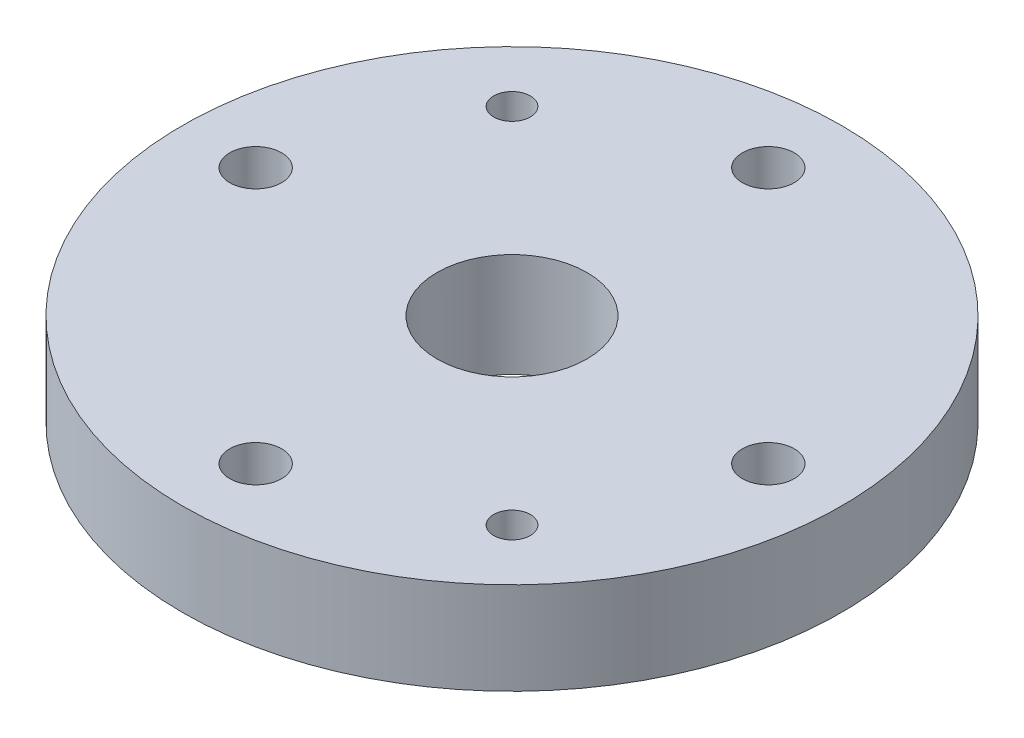
ISO-10303-21;
HEADER;
FILE_DESCRIPTION(('STEP AP214'),'2;1');
FILE_NAME('part.step','',(''),(''),'','','');
FILE_SCHEMA(('AUTOMOTIVE_DESIGN { 1 0 10303 214 1 1 1 1 }'));
ENDSEC;
DATA;
#1=APPLICATION_CONTEXT('core data for automotive mechanical design processes');
#2=APPLICATION_PROTOCOL_DEFINITION('international standard','automotive_design',2000,#1);
#3=PRODUCT_CONTEXT('',#1,'mechanical');
#4=PRODUCT('Part','Part','',(#3));
#5=PRODUCT_RELATED_PRODUCT_CATEGORY('part','',(#4));
#6=PRODUCT_DEFINITION_FORMATION('','',#4);
#7=PRODUCT_DEFINITION_CONTEXT('part definition',#1,'design');
#8=PRODUCT_DEFINITION('design','',#6,#7);
#9=PRODUCT_DEFINITION_SHAPE('','',#8);
#10=(LENGTH_UNIT() NAMED_UNIT(*) SI_UNIT(.MILLI.,.METRE.));
#11=(NAMED_UNIT(*) PLANE_ANGLE_UNIT() SI_UNIT($,.RADIAN.));
#12=(NAMED_UNIT(*) SI_UNIT($,.STERADIAN.) SOLID_ANGLE_UNIT());
#13=UNCERTAINTY_MEASURE_WITH_UNIT(LENGTH_MEASURE(1.E-05),#10,'distance_accuracy_value','');
#14=(GEOMETRIC_REPRESENTATION_CONTEXT(3) GLOBAL_UNCERTAINTY_ASSIGNED_CONTEXT((#13)) GLOBAL_UNIT_ASSIGNED_CONTEXT((#10,
#11,#12)) REPRESENTATION_CONTEXT('',''));
#15=CARTESIAN_POINT('',(0.,0.,0.));
#16=DIRECTION('',(0.,0.,1.));
#17=DIRECTION('',(1.,0.,0.));
#18=AXIS2_PLACEMENT_3D('',#15,#16,#17);
#19=CARTESIAN_POINT('',(0.,-2.,0.));
#20=DIRECTION('',(0.,-1.,0.));
#21=DIRECTION('',(0.,0.,-1.));
#22=AXIS2_PLACEMENT_3D('',#19,#20,#21);
#23=PLANE('',#22);
#24=CARTESIAN_POINT('',(-31.4308964237421,-2.,-31.430896423742));
#25=DIRECTION('',(0.,-1.,0.));
#26=DIRECTION('',(0.,0.,-1.));
#27=AXIS2_PLACEMENT_3D('',#24,#25,#26);
#28=CIRCLE('',#27,3.175);
#29=CARTESIAN_POINT('',(-31.4308964237421,-2.,-34.605896423742));
#30=VERTEX_POINT('',#29);
#31=EDGE_CURVE('E91',#30,#30,#28,.T.);
#32=ORIENTED_EDGE('',*,*,#31,.F.);
#33=EDGE_LOOP('',(#32));
#34=FACE_BOUND('',#33,.T.);
#35=CARTESIAN_POINT('',(31.4308964237421,-2.,31.430896423742));
#36=DIRECTION('',(0.,-1.,0.));
#37=DIRECTION('',(0.,0.,-1.));
#38=AXIS2_PLACEMENT_3D('',#35,#36,#37);
#39=CIRCLE('',#38,3.175);
#40=CARTESIAN_POINT('',(31.4308964237421,-2.,28.255896423742));
#41=VERTEX_POINT('',#40);
#42=EDGE_CURVE('E85',#41,#41,#39,.T.);
#43=ORIENTED_EDGE('',*,*,#42,.F.);
#44=EDGE_LOOP('',(#43));
#45=FACE_BOUND('',#44,.T.);
#46=CARTESIAN_POINT('',(0.,-2.,44.45));
#47=DIRECTION('',(0.,-1.,0.));
#48=DIRECTION('',(0.,0.,-1.));
#49=AXIS2_PLACEMENT_3D('',#46,#47,#48);
#50=CIRCLE('',#49,4.5);
#51=CARTESIAN_POINT('',(0.,-2.,39.95));
#52=VERTEX_POINT('',#51);
#53=EDGE_CURVE('E79',#52,#52,#50,.T.);
#54=ORIENTED_EDGE('',*,*,#53,.F.);
#55=EDGE_LOOP('',(#54));
#56=FACE_BOUND('',#55,.T.);
#57=CARTESIAN_POINT('',(-44.45,-2.,0.));
#58=DIRECTION('',(0.,-1.,0.));
#59=DIRECTION('',(0.,0.,-1.));
#60=AXIS2_PLACEMENT_3D('',#57,#58,#59);
#61=CIRCLE('',#60,4.5);
#62=CARTESIAN_POINT('',(-44.45,-2.,-4.5));
#63=VERTEX_POINT('',#62);
#64=EDGE_CURVE('E73',#63,#63,#61,.T.);
#65=ORIENTED_EDGE('',*,*,#64,.F.);
#66=EDGE_LOOP('',(#65));
#67=FACE_BOUND('',#66,.T.);
#68=CARTESIAN_POINT('',(0.,-2.,-44.45));
#69=DIRECTION('',(0.,-1.,0.));
#70=DIRECTION('',(0.,0.,-1.));
#71=AXIS2_PLACEMENT_3D('',#68,#69,#70);
#72=CIRCLE('',#71,4.5);
#73=CARTESIAN_POINT('',(0.,-2.,-48.95));
#74=VERTEX_POINT('',#73);
#75=EDGE_CURVE('E67',#74,#74,#72,.T.);
#76=ORIENTED_EDGE('',*,*,#75,.F.);
#77=EDGE_LOOP('',(#76));
#78=FACE_BOUND('',#77,.T.);
#79=CARTESIAN_POINT('',(44.45,-2.,0.));
#80=DIRECTION('',(0.,-1.,0.));
#81=DIRECTION('',(0.,0.,-1.));
#82=AXIS2_PLACEMENT_3D('',#79,#80,#81);
#83=CIRCLE('',#82,4.5);
#84=CARTESIAN_POINT('',(44.45,-2.,-4.5));
#85=VERTEX_POINT('',#84);
#86=EDGE_CURVE('E61',#85,#85,#83,.T.);
#87=ORIENTED_EDGE('',*,*,#86,.F.);
#88=EDGE_LOOP('',(#87));
#89=FACE_BOUND('',#88,.T.);
#90=CARTESIAN_POINT('',(0.,-2.,0.));
#91=DIRECTION('',(0.,-1.,0.));
#92=DIRECTION('',(0.,0.,-1.));
#93=AXIS2_PLACEMENT_3D('',#90,#91,#92);
#94=CIRCLE('',#93,57.15);
#95=CARTESIAN_POINT('',(0.,-2.,-57.15));
#96=VERTEX_POINT('',#95);
#97=EDGE_CURVE('E10',#96,#96,#94,.T.);
#98=ORIENTED_EDGE('',*,*,#97,.T.);
#99=EDGE_LOOP('',(#98));
#100=FACE_BOUND('',#99,.T.);
#101=CARTESIAN_POINT('',(0.,-2.,0.));
#102=DIRECTION('',(0.,-1.,0.));
#103=DIRECTION('',(0.,0.,-1.));
#104=AXIS2_PLACEMENT_3D('',#101,#102,#103);
#105=CIRCLE('',#104,15.);
#106=CARTESIAN_POINT('',(0.,-2.,-15.));
#107=VERTEX_POINT('',#106);
#108=EDGE_CURVE('E46',#107,#107,#105,.T.);
#109=ORIENTED_EDGE('',*,*,#108,.F.);
#110=EDGE_LOOP('',(#109));
#111=FACE_BOUND('',#110,.T.);
#112=ADVANCED_FACE('F35',(#34,#45,#56,#67,#78,#89,#100,#111),#23,.T.);
#113=CARTESIAN_POINT('',(0.,169.644610179245,0.));
#114=DIRECTION('',(0.,-1.,0.));
#115=DIRECTION('',(0.,0.,-1.));
#116=AXIS2_PLACEMENT_3D('',#113,#114,#115);
#117=CYLINDRICAL_SURFACE('',#116,57.15);
#118=ORIENTED_EDGE('',*,*,#97,.F.);
#119=EDGE_LOOP('',(#118));
#120=FACE_BOUND('',#119,.T.);
#121=CARTESIAN_POINT('',(0.,14.,0.));
#122=DIRECTION('',(0.,1.,0.));
#123=DIRECTION('',(0.,0.,1.));
#124=AXIS2_PLACEMENT_3D('',#121,#122,#123);
#125=CIRCLE('',#124,57.15);
#126=CARTESIAN_POINT('',(0.,14.,57.15));
#127=VERTEX_POINT('',#126);
#128=EDGE_CURVE('E55',#127,#127,#125,.T.);
#129=ORIENTED_EDGE('',*,*,#128,.F.);
#130=EDGE_LOOP('',(#129));
#131=FACE_BOUND('',#130,.T.);
#132=ADVANCED_FACE('F37',(#120,#131),#117,.T.);
#133=CARTESIAN_POINT('',(0.,44.7695526217005,0.));
#134=DIRECTION('',(0.,-1.,0.));
#135=DIRECTION('',(0.,0.,-1.));
#136=AXIS2_PLACEMENT_3D('',#133,#134,#135);
#137=CYLINDRICAL_SURFACE('',#136,13.);
#138=CARTESIAN_POINT('',(0.,-4.,0.));
#139=DIRECTION('',(0.,-1.,0.));
#140=DIRECTION('',(0.,0.,-1.));
#141=AXIS2_PLACEMENT_3D('',#138,#139,#140);
#142=CIRCLE('',#141,13.);
#143=CARTESIAN_POINT('',(0.,-4.,-13.));
#144=VERTEX_POINT('',#143);
#145=EDGE_CURVE('E51',#144,#144,#142,.T.);
#146=ORIENTED_EDGE('',*,*,#145,.T.);
#147=EDGE_LOOP('',(#146));
#148=FACE_BOUND('',#147,.T.);
#149=CARTESIAN_POINT('',(0.,14.,0.));
#150=DIRECTION('',(0.,1.,0.));
#151=DIRECTION('',(0.,0.,1.));
#152=AXIS2_PLACEMENT_3D('',#149,#150,#151);
#153=CIRCLE('',#152,13.);
#154=CARTESIAN_POINT('',(0.,14.,13.));
#155=VERTEX_POINT('',#154);
#156=EDGE_CURVE('E58',#155,#155,#153,.T.);
#157=ORIENTED_EDGE('',*,*,#156,.T.);
#158=EDGE_LOOP('',(#157));
#159=FACE_BOUND('',#158,.T.);
#160=ADVANCED_FACE('F120',(#148,#159),#137,.F.);
#161=CARTESIAN_POINT('',(0.,-4.,0.));
#162=DIRECTION('',(0.,-1.,0.));
#163=DIRECTION('',(0.,0.,-1.));
#164=AXIS2_PLACEMENT_3D('',#161,#162,#163);
#165=PLANE('',#164);
#166=CARTESIAN_POINT('',(0.,-4.,0.));
#167=DIRECTION('',(0.,-1.,0.));
#168=DIRECTION('',(0.,0.,-1.));
#169=AXIS2_PLACEMENT_3D('',#166,#167,#168);
#170=CIRCLE('',#169,15.);
#171=CARTESIAN_POINT('',(0.,-4.,-15.));
#172=VERTEX_POINT('',#171);
#173=EDGE_CURVE('E42',#172,#172,#170,.T.);
#174=ORIENTED_EDGE('',*,*,#173,.T.);
#175=EDGE_LOOP('',(#174));
#176=FACE_BOUND('',#175,.T.);
#177=ORIENTED_EDGE('',*,*,#145,.F.);
#178=EDGE_LOOP('',(#177));
#179=FACE_BOUND('',#178,.T.);
#180=ADVANCED_FACE('F122',(#176,#179),#165,.T.);
#181=CARTESIAN_POINT('',(0.,-4.,0.));
#182=DIRECTION('',(0.,1.,0.));
#183=DIRECTION('',(0.,0.,1.));
#184=AXIS2_PLACEMENT_3D('',#181,#182,#183);
#185=CYLINDRICAL_SURFACE('',#184,15.);
#186=ORIENTED_EDGE('',*,*,#173,.F.);
#187=EDGE_LOOP('',(#186));
#188=FACE_BOUND('',#187,.T.);
#189=ORIENTED_EDGE('',*,*,#108,.T.);
#190=EDGE_LOOP('',(#189));
#191=FACE_BOUND('',#190,.T.);
#192=ADVANCED_FACE('F104',(#188,#191),#185,.T.);
#193=CARTESIAN_POINT('',(0.,14.,0.));
#194=DIRECTION('',(0.,1.,0.));
#195=DIRECTION('',(0.,0.,1.));
#196=AXIS2_PLACEMENT_3D('',#193,#194,#195);
#197=PLANE('',#196);
#198=CARTESIAN_POINT('',(-31.4308964237421,14.,-31.430896423742));
#199=DIRECTION('',(0.,1.,0.));
#200=DIRECTION('',(0.,0.,1.));
#201=AXIS2_PLACEMENT_3D('',#198,#199,#200);
#202=CIRCLE('',#201,3.175);
#203=CARTESIAN_POINT('',(-31.4308964237421,14.,-28.255896423742));
#204=VERTEX_POINT('',#203);
#205=EDGE_CURVE('E94',#204,#204,#202,.T.);
#206=ORIENTED_EDGE('',*,*,#205,.F.);
#207=EDGE_LOOP('',(#206));
#208=FACE_BOUND('',#207,.T.);
#209=CARTESIAN_POINT('',(31.4308964237421,14.,31.430896423742));
#210=DIRECTION('',(0.,1.,0.));
#211=DIRECTION('',(0.,0.,1.));
#212=AXIS2_PLACEMENT_3D('',#209,#210,#211);
#213=CIRCLE('',#212,3.175);
#214=CARTESIAN_POINT('',(31.4308964237421,14.,34.605896423742));
#215=VERTEX_POINT('',#214);
#216=EDGE_CURVE('E88',#215,#215,#213,.T.);
#217=ORIENTED_EDGE('',*,*,#216,.F.);
#218=EDGE_LOOP('',(#217));
#219=FACE_BOUND('',#218,.T.);
#220=CARTESIAN_POINT('',(0.,14.,44.45));
#221=DIRECTION('',(0.,1.,0.));
#222=DIRECTION('',(0.,0.,1.));
#223=AXIS2_PLACEMENT_3D('',#220,#221,#222);
#224=CIRCLE('',#223,4.5);
#225=CARTESIAN_POINT('',(0.,14.,48.95));
#226=VERTEX_POINT('',#225);
#227=EDGE_CURVE('E82',#226,#226,#224,.T.);
#228=ORIENTED_EDGE('',*,*,#227,.F.);
#229=EDGE_LOOP('',(#228));
#230=FACE_BOUND('',#229,.T.);
#231=CARTESIAN_POINT('',(-44.45,14.,0.));
#232=DIRECTION('',(0.,1.,0.));
#233=DIRECTION('',(0.,0.,1.));
#234=AXIS2_PLACEMENT_3D('',#231,#232,#233);
#235=CIRCLE('',#234,4.5);
#236=CARTESIAN_POINT('',(-44.45,14.,4.5));
#237=VERTEX_POINT('',#236);
#238=EDGE_CURVE('E76',#237,#237,#235,.T.);
#239=ORIENTED_EDGE('',*,*,#238,.F.);
#240=EDGE_LOOP('',(#239));
#241=FACE_BOUND('',#240,.T.);
#242=CARTESIAN_POINT('',(0.,14.,-44.45));
#243=DIRECTION('',(0.,1.,0.));
#244=DIRECTION('',(0.,0.,1.));
#245=AXIS2_PLACEMENT_3D('',#242,#243,#244);
#246=CIRCLE('',#245,4.5);
#247=CARTESIAN_POINT('',(0.,14.,-39.95));
#248=VERTEX_POINT('',#247);
#249=EDGE_CURVE('E70',#248,#248,#246,.T.);
#250=ORIENTED_EDGE('',*,*,#249,.F.);
#251=EDGE_LOOP('',(#250));
#252=FACE_BOUND('',#251,.T.);
#253=CARTESIAN_POINT('',(44.45,14.,0.));
#254=DIRECTION('',(0.,1.,0.));
#255=DIRECTION('',(0.,0.,1.));
#256=AXIS2_PLACEMENT_3D('',#253,#254,#255);
#257=CIRCLE('',#256,4.5);
#258=CARTESIAN_POINT('',(44.45,14.,4.5));
#259=VERTEX_POINT('',#258);
#260=EDGE_CURVE('E64',#259,#259,#257,.T.);
#261=ORIENTED_EDGE('',*,*,#260,.F.);
#262=EDGE_LOOP('',(#261));
#263=FACE_BOUND('',#262,.T.);
#264=ORIENTED_EDGE('',*,*,#128,.T.);
#265=EDGE_LOOP('',(#264));
#266=FACE_BOUND('',#265,.T.);
#267=ORIENTED_EDGE('',*,*,#156,.F.);
#268=EDGE_LOOP('',(#267));
#269=FACE_BOUND('',#268,.T.);
#270=ADVANCED_FACE('F100',(#208,#219,#230,#241,#252,#263,#266,#269),#197,.T.);
#271=CARTESIAN_POINT('',(44.45,14.,0.));
#272=DIRECTION('',(0.,1.,0.));
#273=DIRECTION('',(0.,0.,1.));
#274=AXIS2_PLACEMENT_3D('',#271,#272,#273);
#275=CYLINDRICAL_SURFACE('',#274,4.5);
#276=ORIENTED_EDGE('',*,*,#86,.T.);
#277=EDGE_LOOP('',(#276));
#278=FACE_BOUND('',#277,.T.);
#279=ORIENTED_EDGE('',*,*,#260,.T.);
#280=EDGE_LOOP('',(#279));
#281=FACE_BOUND('',#280,.T.);
#282=ADVANCED_FACE('F103',(#278,#281),#275,.F.);
#283=CARTESIAN_POINT('',(0.,14.,-44.45));
#284=DIRECTION('',(0.,1.,0.));
#285=DIRECTION('',(0.,0.,1.));
#286=AXIS2_PLACEMENT_3D('',#283,#284,#285);
#287=CYLINDRICAL_SURFACE('',#286,4.5);
#288=ORIENTED_EDGE('',*,*,#75,.T.);
#289=EDGE_LOOP('',(#288));
#290=FACE_BOUND('',#289,.T.);
#291=ORIENTED_EDGE('',*,*,#249,.T.);
#292=EDGE_LOOP('',(#291));
#293=FACE_BOUND('',#292,.T.);
#294=ADVANCED_FACE('F143',(#290,#293),#287,.F.);
#295=CARTESIAN_POINT('',(-44.45,14.,0.));
#296=DIRECTION('',(0.,1.,0.));
#297=DIRECTION('',(0.,0.,1.));
#298=AXIS2_PLACEMENT_3D('',#295,#296,#297);
#299=CYLINDRICAL_SURFACE('',#298,4.5);
#300=ORIENTED_EDGE('',*,*,#64,.T.);
#301=EDGE_LOOP('',(#300));
#302=FACE_BOUND('',#301,.T.);
#303=ORIENTED_EDGE('',*,*,#238,.T.);
#304=EDGE_LOOP('',(#303));
#305=FACE_BOUND('',#304,.T.);
#306=ADVANCED_FACE('F147',(#302,#305),#299,.F.);
#307=CARTESIAN_POINT('',(0.,14.,44.45));
#308=DIRECTION('',(0.,1.,0.));
#309=DIRECTION('',(0.,0.,1.));
#310=AXIS2_PLACEMENT_3D('',#307,#308,#309);
#311=CYLINDRICAL_SURFACE('',#310,4.5);
#312=ORIENTED_EDGE('',*,*,#53,.T.);
#313=EDGE_LOOP('',(#312));
#314=FACE_BOUND('',#313,.T.);
#315=ORIENTED_EDGE('',*,*,#227,.T.);
#316=EDGE_LOOP('',(#315));
#317=FACE_BOUND('',#316,.T.);
#318=ADVANCED_FACE('F151',(#314,#317),#311,.F.);
#319=CARTESIAN_POINT('',(31.4308964237421,14.,31.430896423742));
#320=DIRECTION('',(0.,1.,0.));
#321=DIRECTION('',(0.,0.,1.));
#322=AXIS2_PLACEMENT_3D('',#319,#320,#321);
#323=CYLINDRICAL_SURFACE('',#322,3.175);
#324=ORIENTED_EDGE('',*,*,#42,.T.);
#325=EDGE_LOOP('',(#324));
#326=FACE_BOUND('',#325,.T.);
#327=ORIENTED_EDGE('',*,*,#216,.T.);
#328=EDGE_LOOP('',(#327));
#329=FACE_BOUND('',#328,.T.);
#330=ADVANCED_FACE('F155',(#326,#329),#323,.F.);
#331=CARTESIAN_POINT('',(-31.4308964237421,14.,-31.430896423742));
#332=DIRECTION('',(0.,1.,0.));
#333=DIRECTION('',(0.,0.,1.));
#334=AXIS2_PLACEMENT_3D('',#331,#332,#333);
#335=CYLINDRICAL_SURFACE('',#334,3.175);
#336=ORIENTED_EDGE('',*,*,#31,.T.);
#337=EDGE_LOOP('',(#336));
#338=FACE_BOUND('',#337,.T.);
#339=ORIENTED_EDGE('',*,*,#205,.T.);
#340=EDGE_LOOP('',(#339));
#341=FACE_BOUND('',#340,.T.);
#342=ADVANCED_FACE('F98',(#338,#341),#335,.F.);
#343=CLOSED_SHELL('',(#112,#132,#160,#180,#192,#270,#282,#294,#306,#318,#330,#342));
#344=MANIFOLD_SOLID_BREP('B2',#343);
#345=ADVANCED_BREP_SHAPE_REPRESENTATION('',(#18,#344),#14);
#346=SHAPE_DEFINITION_REPRESENTATION(#9,#345);
ENDSEC;
END-ISO-10303-21;
